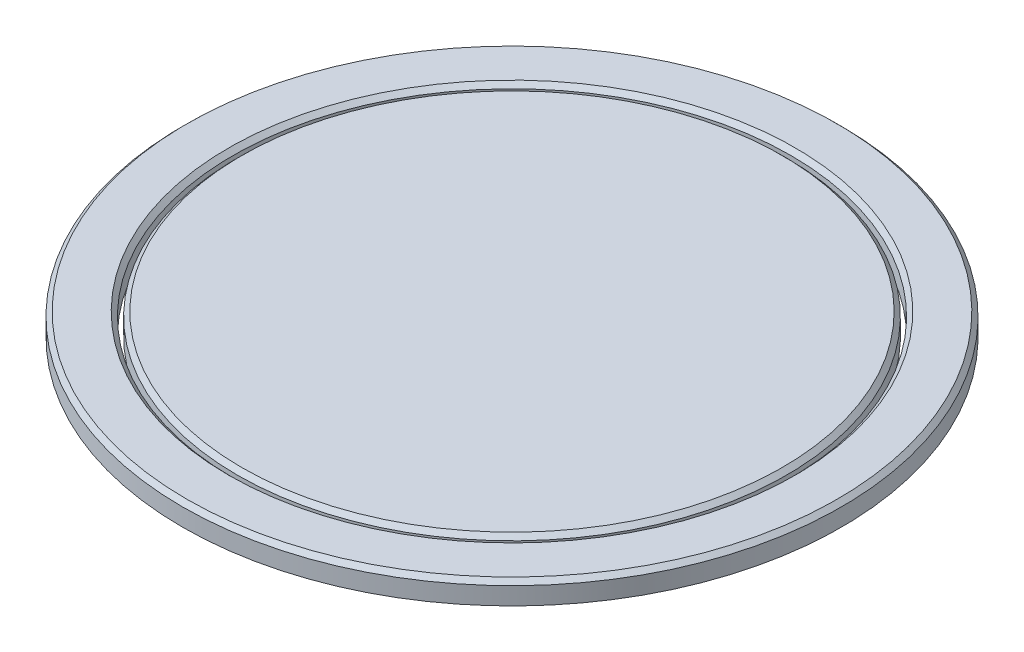
ISO-10303-21;
HEADER;
FILE_DESCRIPTION(('STEP AP214'),'2;1');
FILE_NAME('part.step','',(''),(''),'','','');
FILE_SCHEMA(('AUTOMOTIVE_DESIGN { 1 0 10303 214 1 1 1 1 }'));
ENDSEC;
DATA;
#1=APPLICATION_CONTEXT('core data for automotive mechanical design processes');
#2=APPLICATION_PROTOCOL_DEFINITION('international standard','automotive_design',2000,#1);
#3=PRODUCT_CONTEXT('',#1,'mechanical');
#4=PRODUCT('Part','Part','',(#3));
#5=PRODUCT_RELATED_PRODUCT_CATEGORY('part','',(#4));
#6=PRODUCT_DEFINITION_FORMATION('','',#4);
#7=PRODUCT_DEFINITION_CONTEXT('part definition',#1,'design');
#8=PRODUCT_DEFINITION('design','',#6,#7);
#9=PRODUCT_DEFINITION_SHAPE('','',#8);
#10=(LENGTH_UNIT() NAMED_UNIT(*) SI_UNIT(.MILLI.,.METRE.));
#11=(NAMED_UNIT(*) PLANE_ANGLE_UNIT() SI_UNIT($,.RADIAN.));
#12=(NAMED_UNIT(*) SI_UNIT($,.STERADIAN.) SOLID_ANGLE_UNIT());
#13=UNCERTAINTY_MEASURE_WITH_UNIT(LENGTH_MEASURE(1.E-05),#10,'distance_accuracy_value','');
#14=(GEOMETRIC_REPRESENTATION_CONTEXT(3) GLOBAL_UNCERTAINTY_ASSIGNED_CONTEXT((#13)) GLOBAL_UNIT_ASSIGNED_CONTEXT((#10,
#11,#12)) REPRESENTATION_CONTEXT('',''));
#15=CARTESIAN_POINT('',(0.,0.,0.));
#16=DIRECTION('',(0.,0.,1.));
#17=DIRECTION('',(1.,0.,0.));
#18=AXIS2_PLACEMENT_3D('',#15,#16,#17);
#19=CARTESIAN_POINT('',(0.,2.,0.));
#20=DIRECTION('',(0.,-1.,0.));
#21=DIRECTION('',(0.,0.,-1.));
#22=AXIS2_PLACEMENT_3D('',#19,#20,#21);
#23=CYLINDRICAL_SURFACE('',#22,25.);
#24=CARTESIAN_POINT('',(0.,1.60000000000001,0.));
#25=DIRECTION('',(0.,1.,0.));
#26=DIRECTION('',(0.,0.,1.));
#27=AXIS2_PLACEMENT_3D('',#24,#25,#26);
#28=CIRCLE('',#27,25.);
#29=CARTESIAN_POINT('',(0.,1.60000000000001,25.));
#30=VERTEX_POINT('',#29);
#31=EDGE_CURVE('E12',#30,#30,#28,.F.);
#32=ORIENTED_EDGE('',*,*,#31,.T.);
#33=EDGE_LOOP('',(#32));
#34=FACE_BOUND('',#33,.T.);
#35=CARTESIAN_POINT('',(0.,0.,0.));
#36=DIRECTION('',(0.,1.,0.));
#37=DIRECTION('',(0.,0.,1.));
#38=AXIS2_PLACEMENT_3D('',#35,#36,#37);
#39=CIRCLE('',#38,25.);
#40=CARTESIAN_POINT('',(0.,0.,25.));
#41=VERTEX_POINT('',#40);
#42=EDGE_CURVE('E63',#41,#41,#39,.T.);
#43=ORIENTED_EDGE('',*,*,#42,.T.);
#44=EDGE_LOOP('',(#43));
#45=FACE_BOUND('',#44,.T.);
#46=ADVANCED_FACE('F51',(#34,#45),#23,.T.);
#47=CARTESIAN_POINT('',(0.,2.,0.));
#48=DIRECTION('',(0.,1.,0.));
#49=DIRECTION('',(0.,0.,1.));
#50=AXIS2_PLACEMENT_3D('',#47,#48,#49);
#51=PLANE('',#50);
#52=CARTESIAN_POINT('',(0.,2.,0.));
#53=DIRECTION('',(0.,1.,0.));
#54=DIRECTION('',(0.,0.,1.));
#55=AXIS2_PLACEMENT_3D('',#52,#53,#54);
#56=CIRCLE('',#55,24.6);
#57=CARTESIAN_POINT('',(0.,2.,24.6));
#58=VERTEX_POINT('',#57);
#59=EDGE_CURVE('E59',#58,#58,#56,.T.);
#60=ORIENTED_EDGE('',*,*,#59,.T.);
#61=EDGE_LOOP('',(#60));
#62=FACE_BOUND('',#61,.T.);
#63=ADVANCED_FACE('F73',(#62),#51,.T.);
#64=CARTESIAN_POINT('',(0.,0.,0.));
#65=DIRECTION('',(0.,1.,0.));
#66=DIRECTION('',(0.,0.,1.));
#67=AXIS2_PLACEMENT_3D('',#64,#65,#66);
#68=PLANE('',#67);
#69=ORIENTED_EDGE('',*,*,#42,.F.);
#70=EDGE_LOOP('',(#69));
#71=FACE_BOUND('',#70,.T.);
#72=ADVANCED_FACE('F71',(#71),#68,.F.);
#73=CARTESIAN_POINT('',(0.,2.,0.));
#74=DIRECTION('',(0.,-1.,0.));
#75=DIRECTION('',(0.,0.,-1.));
#76=AXIS2_PLACEMENT_3D('',#73,#74,#75);
#77=CONICAL_SURFACE('',#76,24.6,0.785398163397461);
#78=ORIENTED_EDGE('',*,*,#31,.F.);
#79=EDGE_LOOP('',(#78));
#80=FACE_BOUND('',#79,.T.);
#81=ORIENTED_EDGE('',*,*,#59,.F.);
#82=EDGE_LOOP('',(#81));
#83=FACE_BOUND('',#82,.T.);
#84=ADVANCED_FACE('F54',(#80,#83),#77,.T.);
#85=CLOSED_SHELL('',(#46,#63,#72,#84));
#86=MANIFOLD_SOLID_BREP('B2',#85);
#87=CARTESIAN_POINT('',(0.,2.,0.));
#88=DIRECTION('',(0.,-1.,0.));
#89=DIRECTION('',(0.,0.,-1.));
#90=AXIS2_PLACEMENT_3D('',#87,#88,#89);
#91=CYLINDRICAL_SURFACE('',#90,25.4);
#92=CARTESIAN_POINT('',(0.,1.60000000000001,0.));
#93=DIRECTION('',(0.,1.,0.));
#94=DIRECTION('',(0.,0.,1.));
#95=AXIS2_PLACEMENT_3D('',#92,#93,#94);
#96=CIRCLE('',#95,25.4);
#97=CARTESIAN_POINT('',(0.,1.60000000000001,25.4));
#98=VERTEX_POINT('',#97);
#99=EDGE_CURVE('E50',#98,#98,#96,.T.);
#100=ORIENTED_EDGE('',*,*,#99,.T.);
#101=EDGE_LOOP('',(#100));
#102=FACE_BOUND('',#101,.T.);
#103=CARTESIAN_POINT('',(0.,0.,0.));
#104=DIRECTION('',(0.,1.,0.));
#105=DIRECTION('',(0.,0.,1.));
#106=AXIS2_PLACEMENT_3D('',#103,#104,#105);
#107=CIRCLE('',#106,25.4);
#108=CARTESIAN_POINT('',(0.,0.,25.4));
#109=VERTEX_POINT('',#108);
#110=EDGE_CURVE('E134',#109,#109,#107,.T.);
#111=ORIENTED_EDGE('',*,*,#110,.F.);
#112=EDGE_LOOP('',(#111));
#113=FACE_BOUND('',#112,.T.);
#114=ADVANCED_FACE('F110',(#102,#113),#91,.F.);
#115=CARTESIAN_POINT('',(0.,2.,0.));
#116=DIRECTION('',(0.,-1.,0.));
#117=DIRECTION('',(0.,0.,-1.));
#118=AXIS2_PLACEMENT_3D('',#115,#116,#117);
#119=CYLINDRICAL_SURFACE('',#118,30.);
#120=CARTESIAN_POINT('',(0.,1.59999999999999,0.));
#121=DIRECTION('',(0.,1.,0.));
#122=DIRECTION('',(0.,0.,1.));
#123=AXIS2_PLACEMENT_3D('',#120,#121,#122);
#124=CIRCLE('',#123,30.);
#125=CARTESIAN_POINT('',(0.,1.59999999999999,30.));
#126=VERTEX_POINT('',#125);
#127=EDGE_CURVE('E118',#126,#126,#124,.F.);
#128=ORIENTED_EDGE('',*,*,#127,.T.);
#129=EDGE_LOOP('',(#128));
#130=FACE_BOUND('',#129,.T.);
#131=CARTESIAN_POINT('',(0.,0.,0.));
#132=DIRECTION('',(0.,1.,0.));
#133=DIRECTION('',(0.,0.,1.));
#134=AXIS2_PLACEMENT_3D('',#131,#132,#133);
#135=CIRCLE('',#134,30.);
#136=CARTESIAN_POINT('',(0.,0.,30.));
#137=VERTEX_POINT('',#136);
#138=EDGE_CURVE('E131',#137,#137,#135,.T.);
#139=ORIENTED_EDGE('',*,*,#138,.T.);
#140=EDGE_LOOP('',(#139));
#141=FACE_BOUND('',#140,.T.);
#142=ADVANCED_FACE('F142',(#130,#141),#119,.T.);
#143=CARTESIAN_POINT('',(0.,2.,0.));
#144=DIRECTION('',(0.,1.,0.));
#145=DIRECTION('',(0.,0.,1.));
#146=AXIS2_PLACEMENT_3D('',#143,#144,#145);
#147=PLANE('',#146);
#148=CARTESIAN_POINT('',(0.,2.,0.));
#149=DIRECTION('',(0.,1.,0.));
#150=DIRECTION('',(0.,0.,1.));
#151=AXIS2_PLACEMENT_3D('',#148,#149,#150);
#152=CIRCLE('',#151,29.6);
#153=CARTESIAN_POINT('',(0.,2.,29.6));
#154=VERTEX_POINT('',#153);
#155=EDGE_CURVE('E122',#154,#154,#152,.T.);
#156=ORIENTED_EDGE('',*,*,#155,.T.);
#157=EDGE_LOOP('',(#156));
#158=FACE_BOUND('',#157,.T.);
#159=CARTESIAN_POINT('',(0.,2.,0.));
#160=DIRECTION('',(0.,1.,0.));
#161=DIRECTION('',(0.,0.,1.));
#162=AXIS2_PLACEMENT_3D('',#159,#160,#161);
#163=CIRCLE('',#162,25.8);
#164=CARTESIAN_POINT('',(0.,2.,25.8));
#165=VERTEX_POINT('',#164);
#166=EDGE_CURVE('E126',#165,#165,#163,.F.);
#167=ORIENTED_EDGE('',*,*,#166,.T.);
#168=EDGE_LOOP('',(#167));
#169=FACE_BOUND('',#168,.T.);
#170=ADVANCED_FACE('F147',(#158,#169),#147,.T.);
#171=CARTESIAN_POINT('',(0.,0.,0.));
#172=DIRECTION('',(0.,1.,0.));
#173=DIRECTION('',(0.,0.,1.));
#174=AXIS2_PLACEMENT_3D('',#171,#172,#173);
#175=PLANE('',#174);
#176=ORIENTED_EDGE('',*,*,#110,.T.);
#177=EDGE_LOOP('',(#176));
#178=FACE_BOUND('',#177,.T.);
#179=ORIENTED_EDGE('',*,*,#138,.F.);
#180=EDGE_LOOP('',(#179));
#181=FACE_BOUND('',#180,.T.);
#182=ADVANCED_FACE('F138',(#178,#181),#175,.F.);
#183=CARTESIAN_POINT('',(0.,2.,0.));
#184=DIRECTION('',(0.,-1.,0.));
#185=DIRECTION('',(0.,0.,-1.));
#186=AXIS2_PLACEMENT_3D('',#183,#184,#185);
#187=CONICAL_SURFACE('',#186,29.6,0.78539816339744);
#188=ORIENTED_EDGE('',*,*,#127,.F.);
#189=EDGE_LOOP('',(#188));
#190=FACE_BOUND('',#189,.T.);
#191=ORIENTED_EDGE('',*,*,#155,.F.);
#192=EDGE_LOOP('',(#191));
#193=FACE_BOUND('',#192,.T.);
#194=ADVANCED_FACE('F151',(#190,#193),#187,.T.);
#195=CARTESIAN_POINT('',(0.,1.60000000000001,0.));
#196=DIRECTION('',(0.,1.,0.));
#197=DIRECTION('',(0.,0.,1.));
#198=AXIS2_PLACEMENT_3D('',#195,#196,#197);
#199=CONICAL_SURFACE('',#198,25.4,0.785398163397444);
#200=CARTESIAN_POINT('',(0.,2.,25.8));
#201=CARTESIAN_POINT('',(0.,1.99583333333333,25.7958333333333));
#202=CARTESIAN_POINT('',(0.,1.99166666666667,25.7916666666667));
#203=CARTESIAN_POINT('',(0.,1.98333333333333,25.7833333333333));
#204=CARTESIAN_POINT('',(0.,1.97916666666667,25.7791666666666));
#205=CARTESIAN_POINT('',(0.,1.97083333333333,25.7708333333333));
#206=CARTESIAN_POINT('',(0.,1.96666666666667,25.7666666666666));
#207=CARTESIAN_POINT('',(0.,1.95833333333333,25.7583333333333));
#208=CARTESIAN_POINT('',(0.,1.95416666666667,25.7541666666667));
#209=CARTESIAN_POINT('',(0.,1.94583333333333,25.7458333333333));
#210=CARTESIAN_POINT('',(0.,1.94166666666667,25.7416666666667));
#211=CARTESIAN_POINT('',(0.,1.93333333333334,25.7333333333333));
#212=CARTESIAN_POINT('',(0.,1.92916666666667,25.7291666666667));
#213=CARTESIAN_POINT('',(0.,1.92083333333334,25.7208333333333));
#214=CARTESIAN_POINT('',(0.,1.91666666666667,25.7166666666667));
#215=CARTESIAN_POINT('',(0.,1.90833333333334,25.7083333333333));
#216=CARTESIAN_POINT('',(0.,1.90416666666667,25.7041666666667));
#217=CARTESIAN_POINT('',(0.,1.89583333333334,25.6958333333333));
#218=CARTESIAN_POINT('',(0.,1.89166666666667,25.6916666666667));
#219=CARTESIAN_POINT('',(0.,1.88333333333334,25.6833333333333));
#220=CARTESIAN_POINT('',(0.,1.87916666666667,25.6791666666667));
#221=CARTESIAN_POINT('',(0.,1.87083333333334,25.6708333333333));
#222=CARTESIAN_POINT('',(0.,1.86666666666667,25.6666666666667));
#223=CARTESIAN_POINT('',(0.,1.85833333333334,25.6583333333333));
#224=CARTESIAN_POINT('',(0.,1.85416666666667,25.6541666666667));
#225=CARTESIAN_POINT('',(0.,1.84583333333334,25.6458333333333));
#226=CARTESIAN_POINT('',(0.,1.84166666666667,25.6416666666667));
#227=CARTESIAN_POINT('',(0.,1.83333333333334,25.6333333333333));
#228=CARTESIAN_POINT('',(0.,1.82916666666667,25.6291666666667));
#229=CARTESIAN_POINT('',(0.,1.82083333333334,25.6208333333333));
#230=CARTESIAN_POINT('',(0.,1.81666666666667,25.6166666666667));
#231=CARTESIAN_POINT('',(0.,1.80833333333334,25.6083333333333));
#232=CARTESIAN_POINT('',(0.,1.80416666666667,25.6041666666667));
#233=CARTESIAN_POINT('',(0.,1.79583333333334,25.5958333333333));
#234=CARTESIAN_POINT('',(0.,1.79166666666667,25.5916666666667));
#235=CARTESIAN_POINT('',(0.,1.78333333333334,25.5833333333333));
#236=CARTESIAN_POINT('',(0.,1.77916666666667,25.5791666666667));
#237=CARTESIAN_POINT('',(0.,1.77083333333334,25.5708333333333));
#238=CARTESIAN_POINT('',(0.,1.76666666666667,25.5666666666667));
#239=CARTESIAN_POINT('',(0.,1.75833333333334,25.5583333333333));
#240=CARTESIAN_POINT('',(0.,1.75416666666667,25.5541666666667));
#241=CARTESIAN_POINT('',(0.,1.74583333333334,25.5458333333333));
#242=CARTESIAN_POINT('',(0.,1.74166666666667,25.5416666666667));
#243=CARTESIAN_POINT('',(0.,1.73333333333334,25.5333333333333));
#244=CARTESIAN_POINT('',(0.,1.72916666666668,25.5291666666667));
#245=CARTESIAN_POINT('',(0.,1.72083333333334,25.5208333333333));
#246=CARTESIAN_POINT('',(0.,1.71666666666668,25.5166666666667));
#247=CARTESIAN_POINT('',(0.,1.70833333333334,25.5083333333333));
#248=CARTESIAN_POINT('',(0.,1.70416666666668,25.5041666666667));
#249=CARTESIAN_POINT('',(0.,1.69583333333334,25.4958333333333));
#250=CARTESIAN_POINT('',(0.,1.69166666666668,25.4916666666667));
#251=CARTESIAN_POINT('',(0.,1.68333333333334,25.4833333333333));
#252=CARTESIAN_POINT('',(0.,1.67916666666668,25.4791666666667));
#253=CARTESIAN_POINT('',(0.,1.67083333333334,25.4708333333333));
#254=CARTESIAN_POINT('',(0.,1.66666666666668,25.4666666666667));
#255=CARTESIAN_POINT('',(0.,1.65833333333334,25.4583333333333));
#256=CARTESIAN_POINT('',(0.,1.65416666666668,25.4541666666667));
#257=CARTESIAN_POINT('',(0.,1.64583333333334,25.4458333333333));
#258=CARTESIAN_POINT('',(0.,1.64166666666668,25.4416666666667));
#259=CARTESIAN_POINT('',(0.,1.63333333333334,25.4333333333333));
#260=CARTESIAN_POINT('',(0.,1.62916666666668,25.4291666666667));
#261=CARTESIAN_POINT('',(0.,1.62083333333335,25.4208333333333));
#262=CARTESIAN_POINT('',(0.,1.61666666666668,25.4166666666667));
#263=CARTESIAN_POINT('',(0.,1.60833333333335,25.4083333333333));
#264=CARTESIAN_POINT('',(0.,1.60416666666668,25.4041666666667));
#265=CARTESIAN_POINT('',(0.,1.60000000000001,25.4));
#266=B_SPLINE_CURVE_WITH_KNOTS('',3,(#200,#201,#202,#203,#204,#205,#206,#207,#208,#209,#210,
#211,#212,#213,#214,#215,#216,#217,#218,#219,#220,#221,#222,#223,#224,#225,#226,#227,#228,#229,
#230,#231,#232,#233,#234,#235,#236,#237,#238,#239,#240,#241,#242,#243,#244,#245,#246,#247,#248,
#249,#250,#251,#252,#253,#254,#255,#256,#257,#258,#259,#260,#261,#262,#263,#264,#265),
.UNSPECIFIED.,.F.,.F.,(4,2,2,2,2,2,2,2,2,2,2,2,2,2,2,2,2,2,2,2,2,2,2,2,2,2,2,2,2,2,2,2,4),(0.,
0.0176776695296624,0.0353553390593272,0.0530330085889895,0.070710678118652,0.0883883476483145,
0.106066017177979,0.123743686707642,0.141421356237304,0.159099025766967,0.176776695296632,
0.194454364826294,0.212132034355956,0.229809703885619,0.247487373415284,0.265165042944946,
0.282842712474609,0.300520382004271,0.318198051533936,0.335875721063598,0.353553390593261,
0.371231060122923,0.388908729652588,0.40658639918225,0.424264068711913,0.441941738241575,
0.45961940777124,0.477297077300903,0.494974746830565,0.512652416360228,0.530330085889892,
0.548007755419555,0.565685424949217),.UNSPECIFIED.);
#267=EDGE_CURVE('BSEAM113',#165,#98,#266,.T.);
#268=ORIENTED_EDGE('',*,*,#166,.F.);
#269=ORIENTED_EDGE('',*,*,#99,.F.);
#270=ORIENTED_EDGE('',*,*,#267,.T.);
#271=ORIENTED_EDGE('',*,*,#267,.F.);
#272=EDGE_LOOP('',(#268,#270,#269,#271));
#273=FACE_BOUND('',#272,.T.);
#274=ADVANCED_FACE('F113',(#273),#199,.F.);
#275=CLOSED_SHELL('',(#114,#142,#170,#182,#194,#274));
#276=MANIFOLD_SOLID_BREP('B7',#275);
#277=ADVANCED_BREP_SHAPE_REPRESENTATION('',(#18,#86,#276),#14);
#278=SHAPE_DEFINITION_REPRESENTATION(#9,#277);
ENDSEC;
END-ISO-10303-21;
